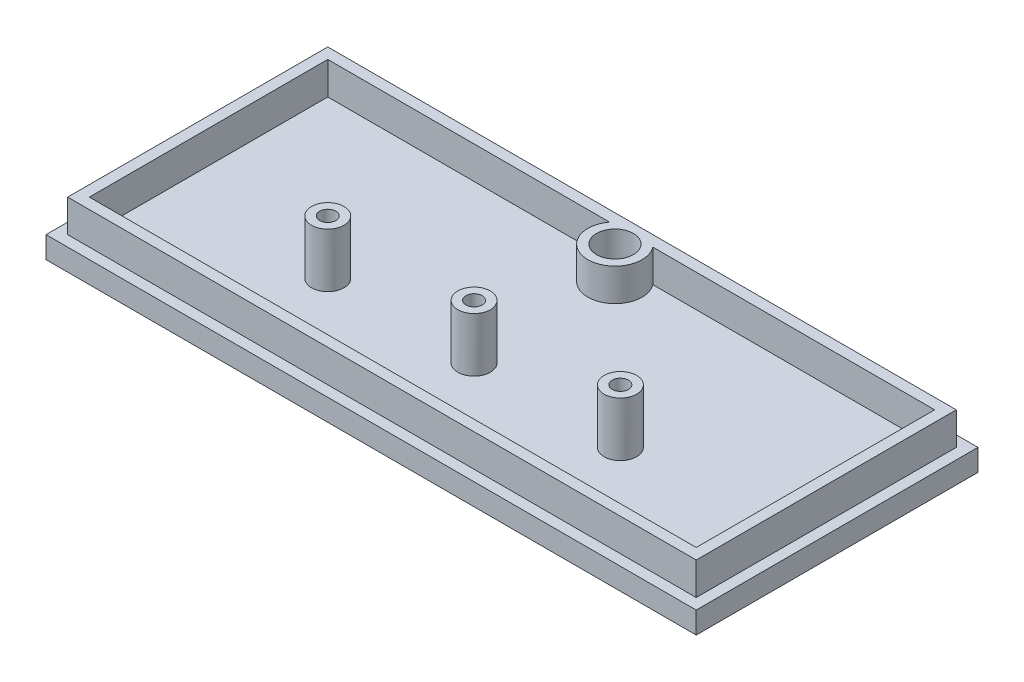
ISO-10303-21;
HEADER;
FILE_DESCRIPTION(('STEP AP214'),'2;1');
FILE_NAME('part.step','',(''),(''),'','','');
FILE_SCHEMA(('AUTOMOTIVE_DESIGN { 1 0 10303 214 1 1 1 1 }'));
ENDSEC;
DATA;
#1=APPLICATION_CONTEXT('core data for automotive mechanical design processes');
#2=APPLICATION_PROTOCOL_DEFINITION('international standard','automotive_design',2000,#1);
#3=PRODUCT_CONTEXT('',#1,'mechanical');
#4=PRODUCT('Part','Part','',(#3));
#5=PRODUCT_RELATED_PRODUCT_CATEGORY('part','',(#4));
#6=PRODUCT_DEFINITION_FORMATION('','',#4);
#7=PRODUCT_DEFINITION_CONTEXT('part definition',#1,'design');
#8=PRODUCT_DEFINITION('design','',#6,#7);
#9=PRODUCT_DEFINITION_SHAPE('','',#8);
#10=(LENGTH_UNIT() NAMED_UNIT(*) SI_UNIT(.MILLI.,.METRE.));
#11=(NAMED_UNIT(*) PLANE_ANGLE_UNIT() SI_UNIT($,.RADIAN.));
#12=(NAMED_UNIT(*) SI_UNIT($,.STERADIAN.) SOLID_ANGLE_UNIT());
#13=UNCERTAINTY_MEASURE_WITH_UNIT(LENGTH_MEASURE(1.E-05),#10,'distance_accuracy_value','');
#14=(GEOMETRIC_REPRESENTATION_CONTEXT(3) GLOBAL_UNCERTAINTY_ASSIGNED_CONTEXT((#13)) GLOBAL_UNIT_ASSIGNED_CONTEXT((#10,
#11,#12)) REPRESENTATION_CONTEXT('',''));
#15=CARTESIAN_POINT('',(0.,0.,0.));
#16=DIRECTION('',(0.,0.,1.));
#17=DIRECTION('',(1.,0.,0.));
#18=AXIS2_PLACEMENT_3D('',#15,#16,#17);
#19=CARTESIAN_POINT('',(2.,5.,-24.));
#20=DIRECTION('',(0.,0.,1.));
#21=DIRECTION('',(1.,0.,0.));
#22=AXIS2_PLACEMENT_3D('',#19,#20,#21);
#23=PLANE('',#22);
#24=DIRECTION('',(-1.,0.,0.));
#25=VECTOR('',#24,1.);
#26=CARTESIAN_POINT('',(2.,2.,-24.));
#27=LINE('',#26,#25);
#28=CARTESIAN_POINT('',(28.,2.,-24.));
#29=VERTEX_POINT('',#28);
#30=CARTESIAN_POINT('',(2.,2.,-24.));
#31=VERTEX_POINT('',#30);
#32=EDGE_CURVE('E144',#29,#31,#27,.T.);
#33=ORIENTED_EDGE('',*,*,#32,.F.);
#34=DIRECTION('',(0.,-1.,0.));
#35=VECTOR('',#34,1.);
#36=CARTESIAN_POINT('',(28.,5.,-24.));
#37=LINE('',#36,#35);
#38=CARTESIAN_POINT('',(28.,5.,-24.));
#39=VERTEX_POINT('',#38);
#40=EDGE_CURVE('E49',#29,#39,#37,.F.);
#41=ORIENTED_EDGE('',*,*,#40,.T.);
#42=DIRECTION('',(-1.,0.,0.));
#43=VECTOR('',#42,1.);
#44=CARTESIAN_POINT('',(2.,5.,-24.));
#45=LINE('',#44,#43);
#46=CARTESIAN_POINT('',(2.,5.,-24.));
#47=VERTEX_POINT('',#46);
#48=EDGE_CURVE('E191',#39,#47,#45,.T.);
#49=ORIENTED_EDGE('',*,*,#48,.T.);
#50=DIRECTION('',(0.,-1.,0.));
#51=VECTOR('',#50,1.);
#52=CARTESIAN_POINT('',(2.,5.,-24.));
#53=LINE('',#52,#51);
#54=EDGE_CURVE('E193',#47,#31,#53,.T.);
#55=ORIENTED_EDGE('',*,*,#54,.T.);
#56=EDGE_LOOP('',(#33,#41,#49,#55));
#57=FACE_BOUND('',#56,.T.);
#58=ADVANCED_FACE('F33',(#57),#23,.T.);
#59=CARTESIAN_POINT('',(58.,5.,-24.));
#60=VERTEX_POINT('',#59);
#61=CARTESIAN_POINT('',(32.,5.,-24.));
#62=VERTEX_POINT('',#61);
#63=EDGE_CURVE('E57',#60,#62,#45,.T.);
#64=ORIENTED_EDGE('',*,*,#63,.T.);
#65=DIRECTION('',(0.,-1.,0.));
#66=VECTOR('',#65,1.);
#67=CARTESIAN_POINT('',(32.,5.,-24.));
#68=LINE('',#67,#66);
#69=CARTESIAN_POINT('',(32.,2.,-24.));
#70=VERTEX_POINT('',#69);
#71=EDGE_CURVE('E146',#62,#70,#68,.T.);
#72=ORIENTED_EDGE('',*,*,#71,.T.);
#73=CARTESIAN_POINT('',(58.,2.,-24.));
#74=VERTEX_POINT('',#73);
#75=EDGE_CURVE('E137',#74,#70,#27,.T.);
#76=ORIENTED_EDGE('',*,*,#75,.F.);
#77=DIRECTION('',(0.,-1.,0.));
#78=VECTOR('',#77,1.);
#79=CARTESIAN_POINT('',(58.,5.,-24.));
#80=LINE('',#79,#78);
#81=EDGE_CURVE('E201',#60,#74,#80,.T.);
#82=ORIENTED_EDGE('',*,*,#81,.F.);
#83=EDGE_LOOP('',(#64,#72,#76,#82));
#84=FACE_BOUND('',#83,.T.);
#85=ADVANCED_FACE('F147',(#84),#23,.T.);
#86=CARTESIAN_POINT('',(0.,2.,0.));
#87=DIRECTION('',(0.,-1.,0.));
#88=DIRECTION('',(0.,0.,-1.));
#89=AXIS2_PLACEMENT_3D('',#86,#87,#88);
#90=PLANE('',#89);
#91=DIRECTION('',(0.,0.,1.));
#92=VECTOR('',#91,1.);
#93=CARTESIAN_POINT('',(0.,2.,0.));
#94=LINE('',#93,#92);
#95=CARTESIAN_POINT('',(0.,2.,-26.));
#96=VERTEX_POINT('',#95);
#97=CARTESIAN_POINT('',(0.,2.,0.));
#98=VERTEX_POINT('',#97);
#99=EDGE_CURVE('E241',#96,#98,#94,.T.);
#100=ORIENTED_EDGE('',*,*,#99,.T.);
#101=DIRECTION('',(1.,0.,0.));
#102=VECTOR('',#101,1.);
#103=CARTESIAN_POINT('',(0.,2.,0.));
#104=LINE('',#103,#102);
#105=CARTESIAN_POINT('',(60.,2.,0.));
#106=VERTEX_POINT('',#105);
#107=EDGE_CURVE('E244',#98,#106,#104,.T.);
#108=ORIENTED_EDGE('',*,*,#107,.T.);
#109=DIRECTION('',(0.,0.,-1.));
#110=VECTOR('',#109,1.);
#111=CARTESIAN_POINT('',(60.,2.,0.));
#112=LINE('',#111,#110);
#113=CARTESIAN_POINT('',(60.,2.,-26.));
#114=VERTEX_POINT('',#113);
#115=EDGE_CURVE('E247',#106,#114,#112,.T.);
#116=ORIENTED_EDGE('',*,*,#115,.T.);
#117=DIRECTION('',(-1.,0.,0.));
#118=VECTOR('',#117,1.);
#119=CARTESIAN_POINT('',(0.,2.,-26.));
#120=LINE('',#119,#118);
#121=EDGE_CURVE('E249',#114,#96,#120,.T.);
#122=ORIENTED_EDGE('',*,*,#121,.T.);
#123=EDGE_LOOP('',(#100,#108,#116,#122));
#124=FACE_BOUND('',#123,.T.);
#125=DIRECTION('',(0.,0.,1.));
#126=VECTOR('',#125,1.);
#127=CARTESIAN_POINT('',(0.999999999999995,2.,-25.));
#128=LINE('',#127,#126);
#129=CARTESIAN_POINT('',(0.999999999999995,2.,-25.));
#130=VERTEX_POINT('',#129);
#131=CARTESIAN_POINT('',(0.999999999999998,2.,-1.));
#132=VERTEX_POINT('',#131);
#133=EDGE_CURVE('E208',#130,#132,#128,.T.);
#134=ORIENTED_EDGE('',*,*,#133,.F.);
#135=DIRECTION('',(-1.,0.,0.));
#136=VECTOR('',#135,1.);
#137=CARTESIAN_POINT('',(0.999999999999995,2.,-25.));
#138=LINE('',#137,#136);
#139=CARTESIAN_POINT('',(59.,2.,-25.));
#140=VERTEX_POINT('',#139);
#141=EDGE_CURVE('E213',#140,#130,#138,.T.);
#142=ORIENTED_EDGE('',*,*,#141,.F.);
#143=DIRECTION('',(0.,0.,-1.));
#144=VECTOR('',#143,1.);
#145=CARTESIAN_POINT('',(59.,2.,-25.));
#146=LINE('',#145,#144);
#147=CARTESIAN_POINT('',(59.,2.,-1.));
#148=VERTEX_POINT('',#147);
#149=EDGE_CURVE('E225',#148,#140,#146,.T.);
#150=ORIENTED_EDGE('',*,*,#149,.F.);
#151=DIRECTION('',(1.,0.,0.));
#152=VECTOR('',#151,1.);
#153=CARTESIAN_POINT('',(0.999999999999998,2.,-1.));
#154=LINE('',#153,#152);
#155=EDGE_CURVE('E222',#132,#148,#154,.T.);
#156=ORIENTED_EDGE('',*,*,#155,.F.);
#157=EDGE_LOOP('',(#134,#142,#150,#156));
#158=FACE_BOUND('',#157,.T.);
#159=ADVANCED_FACE('F286',(#124,#158),#90,.F.);
#160=CARTESIAN_POINT('',(0.,2.,0.));
#161=DIRECTION('',(1.,0.,0.));
#162=DIRECTION('',(0.,0.,-1.));
#163=AXIS2_PLACEMENT_3D('',#160,#161,#162);
#164=PLANE('',#163);
#165=DIRECTION('',(0.,0.,1.));
#166=VECTOR('',#165,1.);
#167=CARTESIAN_POINT('',(0.,0.,0.));
#168=LINE('',#167,#166);
#169=CARTESIAN_POINT('',(0.,0.,-26.));
#170=VERTEX_POINT('',#169);
#171=CARTESIAN_POINT('',(0.,0.,0.));
#172=VERTEX_POINT('',#171);
#173=EDGE_CURVE('E240',#170,#172,#168,.T.);
#174=ORIENTED_EDGE('',*,*,#173,.T.);
#175=DIRECTION('',(0.,-1.,0.));
#176=VECTOR('',#175,1.);
#177=CARTESIAN_POINT('',(0.,2.,0.));
#178=LINE('',#177,#176);
#179=EDGE_CURVE('E267',#98,#172,#178,.T.);
#180=ORIENTED_EDGE('',*,*,#179,.F.);
#181=ORIENTED_EDGE('',*,*,#99,.F.);
#182=DIRECTION('',(0.,-1.,0.));
#183=VECTOR('',#182,1.);
#184=CARTESIAN_POINT('',(0.,2.,-26.));
#185=LINE('',#184,#183);
#186=EDGE_CURVE('E251',#96,#170,#185,.T.);
#187=ORIENTED_EDGE('',*,*,#186,.T.);
#188=EDGE_LOOP('',(#174,#180,#181,#187));
#189=FACE_BOUND('',#188,.T.);
#190=ADVANCED_FACE('F35',(#189),#164,.F.);
#191=CARTESIAN_POINT('',(0.,2.,0.));
#192=DIRECTION('',(0.,0.,-1.));
#193=DIRECTION('',(-1.,0.,0.));
#194=AXIS2_PLACEMENT_3D('',#191,#192,#193);
#195=PLANE('',#194);
#196=DIRECTION('',(1.,0.,0.));
#197=VECTOR('',#196,1.);
#198=CARTESIAN_POINT('',(0.,0.,0.));
#199=LINE('',#198,#197);
#200=CARTESIAN_POINT('',(60.,0.,0.));
#201=VERTEX_POINT('',#200);
#202=EDGE_CURVE('E254',#172,#201,#199,.T.);
#203=ORIENTED_EDGE('',*,*,#202,.T.);
#204=DIRECTION('',(0.,-1.,0.));
#205=VECTOR('',#204,1.);
#206=CARTESIAN_POINT('',(60.,2.,0.));
#207=LINE('',#206,#205);
#208=EDGE_CURVE('E264',#106,#201,#207,.T.);
#209=ORIENTED_EDGE('',*,*,#208,.F.);
#210=ORIENTED_EDGE('',*,*,#107,.F.);
#211=ORIENTED_EDGE('',*,*,#179,.T.);
#212=EDGE_LOOP('',(#203,#209,#210,#211));
#213=FACE_BOUND('',#212,.T.);
#214=ADVANCED_FACE('F353',(#213),#195,.F.);
#215=CARTESIAN_POINT('',(60.,2.,0.));
#216=DIRECTION('',(-1.,0.,0.));
#217=DIRECTION('',(0.,0.,1.));
#218=AXIS2_PLACEMENT_3D('',#215,#216,#217);
#219=PLANE('',#218);
#220=DIRECTION('',(0.,0.,-1.));
#221=VECTOR('',#220,1.);
#222=CARTESIAN_POINT('',(60.,0.,0.));
#223=LINE('',#222,#221);
#224=CARTESIAN_POINT('',(60.,0.,-26.));
#225=VERTEX_POINT('',#224);
#226=EDGE_CURVE('E256',#201,#225,#223,.T.);
#227=ORIENTED_EDGE('',*,*,#226,.T.);
#228=DIRECTION('',(0.,-1.,0.));
#229=VECTOR('',#228,1.);
#230=CARTESIAN_POINT('',(60.,2.,-26.));
#231=LINE('',#230,#229);
#232=EDGE_CURVE('E261',#114,#225,#231,.T.);
#233=ORIENTED_EDGE('',*,*,#232,.F.);
#234=ORIENTED_EDGE('',*,*,#115,.F.);
#235=ORIENTED_EDGE('',*,*,#208,.T.);
#236=EDGE_LOOP('',(#227,#233,#234,#235));
#237=FACE_BOUND('',#236,.T.);
#238=ADVANCED_FACE('F350',(#237),#219,.F.);
#239=CARTESIAN_POINT('',(0.,2.,-26.));
#240=DIRECTION('',(0.,0.,1.));
#241=DIRECTION('',(1.,0.,0.));
#242=AXIS2_PLACEMENT_3D('',#239,#240,#241);
#243=PLANE('',#242);
#244=DIRECTION('',(-1.,0.,0.));
#245=VECTOR('',#244,1.);
#246=CARTESIAN_POINT('',(0.,0.,-26.));
#247=LINE('',#246,#245);
#248=EDGE_CURVE('E245',#225,#170,#247,.T.);
#249=ORIENTED_EDGE('',*,*,#248,.T.);
#250=ORIENTED_EDGE('',*,*,#186,.F.);
#251=ORIENTED_EDGE('',*,*,#121,.F.);
#252=ORIENTED_EDGE('',*,*,#232,.T.);
#253=EDGE_LOOP('',(#249,#250,#251,#252));
#254=FACE_BOUND('',#253,.T.);
#255=ADVANCED_FACE('F346',(#254),#243,.F.);
#256=CARTESIAN_POINT('',(0.,0.,0.));
#257=DIRECTION('',(0.,-1.,0.));
#258=DIRECTION('',(0.,0.,-1.));
#259=AXIS2_PLACEMENT_3D('',#256,#257,#258);
#260=PLANE('',#259);
#261=CARTESIAN_POINT('',(30.,0.,-22.5));
#262=DIRECTION('',(0.,-1.,0.));
#263=DIRECTION('',(0.,0.,-1.));
#264=AXIS2_PLACEMENT_3D('',#261,#262,#263);
#265=CIRCLE('',#264,3.15);
#266=CARTESIAN_POINT('',(30.,0.,-25.65));
#267=VERTEX_POINT('',#266);
#268=EDGE_CURVE('E397',#267,#267,#265,.T.);
#269=ORIENTED_EDGE('',*,*,#268,.F.);
#270=EDGE_LOOP('',(#269));
#271=FACE_BOUND('',#270,.T.);
#272=ORIENTED_EDGE('',*,*,#173,.F.);
#273=ORIENTED_EDGE('',*,*,#248,.F.);
#274=ORIENTED_EDGE('',*,*,#226,.F.);
#275=ORIENTED_EDGE('',*,*,#202,.F.);
#276=EDGE_LOOP('',(#272,#273,#274,#275));
#277=FACE_BOUND('',#276,.T.);
#278=ADVANCED_FACE('F328',(#271,#277),#260,.T.);
#279=CARTESIAN_POINT('',(0.,5.,0.));
#280=DIRECTION('',(0.,1.,0.));
#281=DIRECTION('',(0.,0.,1.));
#282=AXIS2_PLACEMENT_3D('',#279,#280,#281);
#283=PLANE('',#282);
#284=CARTESIAN_POINT('',(30.,5.,-22.5));
#285=DIRECTION('',(0.,1.,0.));
#286=DIRECTION('',(0.,0.,1.));
#287=AXIS2_PLACEMENT_3D('',#284,#285,#286);
#288=CIRCLE('',#287,1.7);
#289=CARTESIAN_POINT('',(30.,5.,-20.8));
#290=VERTEX_POINT('',#289);
#291=EDGE_CURVE('E37',#290,#290,#288,.T.);
#292=ORIENTED_EDGE('',*,*,#291,.F.);
#293=EDGE_LOOP('',(#292));
#294=FACE_BOUND('',#293,.T.);
#295=DIRECTION('',(-1.,0.,0.));
#296=VECTOR('',#295,1.);
#297=CARTESIAN_POINT('',(0.999999999999995,5.,-25.));
#298=LINE('',#297,#296);
#299=CARTESIAN_POINT('',(59.,5.,-25.));
#300=VERTEX_POINT('',#299);
#301=CARTESIAN_POINT('',(0.999999999999995,5.,-25.));
#302=VERTEX_POINT('',#301);
#303=EDGE_CURVE('E217',#300,#302,#298,.T.);
#304=ORIENTED_EDGE('',*,*,#303,.T.);
#305=DIRECTION('',(0.,0.,1.));
#306=VECTOR('',#305,1.);
#307=CARTESIAN_POINT('',(0.999999999999995,5.,-25.));
#308=LINE('',#307,#306);
#309=CARTESIAN_POINT('',(0.999999999999998,5.,-1.));
#310=VERTEX_POINT('',#309);
#311=EDGE_CURVE('E209',#302,#310,#308,.T.);
#312=ORIENTED_EDGE('',*,*,#311,.T.);
#313=DIRECTION('',(1.,0.,0.));
#314=VECTOR('',#313,1.);
#315=CARTESIAN_POINT('',(0.999999999999998,5.,-1.));
#316=LINE('',#315,#314);
#317=CARTESIAN_POINT('',(59.,5.,-1.));
#318=VERTEX_POINT('',#317);
#319=EDGE_CURVE('E212',#310,#318,#316,.T.);
#320=ORIENTED_EDGE('',*,*,#319,.T.);
#321=DIRECTION('',(0.,0.,-1.));
#322=VECTOR('',#321,1.);
#323=CARTESIAN_POINT('',(59.,5.,-25.));
#324=LINE('',#323,#322);
#325=EDGE_CURVE('E215',#318,#300,#324,.T.);
#326=ORIENTED_EDGE('',*,*,#325,.T.);
#327=EDGE_LOOP('',(#304,#312,#320,#326));
#328=FACE_BOUND('',#327,.T.);
#329=ORIENTED_EDGE('',*,*,#48,.F.);
#330=CARTESIAN_POINT('',(30.,5.,-22.5));
#331=DIRECTION('',(0.,1.,0.));
#332=DIRECTION('',(0.,0.,1.));
#333=AXIS2_PLACEMENT_3D('',#330,#331,#332);
#334=CIRCLE('',#333,2.5);
#335=EDGE_CURVE('E151',#39,#62,#334,.T.);
#336=ORIENTED_EDGE('',*,*,#335,.T.);
#337=ORIENTED_EDGE('',*,*,#63,.F.);
#338=DIRECTION('',(0.,0.,-1.));
#339=VECTOR('',#338,1.);
#340=CARTESIAN_POINT('',(58.,5.,-24.));
#341=LINE('',#340,#339);
#342=CARTESIAN_POINT('',(58.,5.,-2.));
#343=VERTEX_POINT('',#342);
#344=EDGE_CURVE('E188',#343,#60,#341,.T.);
#345=ORIENTED_EDGE('',*,*,#344,.F.);
#346=DIRECTION('',(1.,0.,0.));
#347=VECTOR('',#346,1.);
#348=CARTESIAN_POINT('',(2.,5.,-2.));
#349=LINE('',#348,#347);
#350=CARTESIAN_POINT('',(2.,5.,-2.));
#351=VERTEX_POINT('',#350);
#352=EDGE_CURVE('E186',#351,#343,#349,.T.);
#353=ORIENTED_EDGE('',*,*,#352,.F.);
#354=DIRECTION('',(0.,0.,1.));
#355=VECTOR('',#354,1.);
#356=CARTESIAN_POINT('',(2.,5.,-24.));
#357=LINE('',#356,#355);
#358=EDGE_CURVE('E143',#47,#351,#357,.T.);
#359=ORIENTED_EDGE('',*,*,#358,.F.);
#360=EDGE_LOOP('',(#329,#336,#337,#345,#353,#359));
#361=FACE_BOUND('',#360,.T.);
#362=ADVANCED_FACE('F324',(#294,#328,#361),#283,.T.);
#363=CARTESIAN_POINT('',(0.999999999999995,5.,-25.));
#364=DIRECTION('',(1.,0.,0.));
#365=DIRECTION('',(0.,0.,-1.));
#366=AXIS2_PLACEMENT_3D('',#363,#364,#365);
#367=PLANE('',#366);
#368=ORIENTED_EDGE('',*,*,#133,.T.);
#369=DIRECTION('',(0.,-1.,0.));
#370=VECTOR('',#369,1.);
#371=CARTESIAN_POINT('',(0.999999999999998,5.,-1.));
#372=LINE('',#371,#370);
#373=EDGE_CURVE('E237',#310,#132,#372,.T.);
#374=ORIENTED_EDGE('',*,*,#373,.F.);
#375=ORIENTED_EDGE('',*,*,#311,.F.);
#376=DIRECTION('',(0.,-1.,0.));
#377=VECTOR('',#376,1.);
#378=CARTESIAN_POINT('',(0.999999999999995,5.,-25.));
#379=LINE('',#378,#377);
#380=EDGE_CURVE('E219',#302,#130,#379,.T.);
#381=ORIENTED_EDGE('',*,*,#380,.T.);
#382=EDGE_LOOP('',(#368,#374,#375,#381));
#383=FACE_BOUND('',#382,.T.);
#384=ADVANCED_FACE('F327',(#383),#367,.F.);
#385=CARTESIAN_POINT('',(0.999999999999998,5.,-1.));
#386=DIRECTION('',(0.,0.,-1.));
#387=DIRECTION('',(-1.,0.,0.));
#388=AXIS2_PLACEMENT_3D('',#385,#386,#387);
#389=PLANE('',#388);
#390=ORIENTED_EDGE('',*,*,#155,.T.);
#391=DIRECTION('',(0.,-1.,0.));
#392=VECTOR('',#391,1.);
#393=CARTESIAN_POINT('',(59.,5.,-1.));
#394=LINE('',#393,#392);
#395=EDGE_CURVE('E234',#318,#148,#394,.T.);
#396=ORIENTED_EDGE('',*,*,#395,.F.);
#397=ORIENTED_EDGE('',*,*,#319,.F.);
#398=ORIENTED_EDGE('',*,*,#373,.T.);
#399=EDGE_LOOP('',(#390,#396,#397,#398));
#400=FACE_BOUND('',#399,.T.);
#401=ADVANCED_FACE('F336',(#400),#389,.F.);
#402=CARTESIAN_POINT('',(59.,5.,-25.));
#403=DIRECTION('',(-1.,0.,0.));
#404=DIRECTION('',(0.,0.,1.));
#405=AXIS2_PLACEMENT_3D('',#402,#403,#404);
#406=PLANE('',#405);
#407=ORIENTED_EDGE('',*,*,#149,.T.);
#408=DIRECTION('',(0.,-1.,0.));
#409=VECTOR('',#408,1.);
#410=CARTESIAN_POINT('',(59.,5.,-25.));
#411=LINE('',#410,#409);
#412=EDGE_CURVE('E231',#300,#140,#411,.T.);
#413=ORIENTED_EDGE('',*,*,#412,.F.);
#414=ORIENTED_EDGE('',*,*,#325,.F.);
#415=ORIENTED_EDGE('',*,*,#395,.T.);
#416=EDGE_LOOP('',(#407,#413,#414,#415));
#417=FACE_BOUND('',#416,.T.);
#418=ADVANCED_FACE('F332',(#417),#406,.F.);
#419=CARTESIAN_POINT('',(0.999999999999995,5.,-25.));
#420=DIRECTION('',(0.,0.,1.));
#421=DIRECTION('',(1.,0.,0.));
#422=AXIS2_PLACEMENT_3D('',#419,#420,#421);
#423=PLANE('',#422);
#424=ORIENTED_EDGE('',*,*,#141,.T.);
#425=ORIENTED_EDGE('',*,*,#380,.F.);
#426=ORIENTED_EDGE('',*,*,#303,.F.);
#427=ORIENTED_EDGE('',*,*,#412,.T.);
#428=EDGE_LOOP('',(#424,#425,#426,#427));
#429=FACE_BOUND('',#428,.T.);
#430=ADVANCED_FACE('F322',(#429),#423,.F.);
#431=CARTESIAN_POINT('',(2.,5.,-24.));
#432=DIRECTION('',(1.,0.,0.));
#433=DIRECTION('',(0.,0.,-1.));
#434=AXIS2_PLACEMENT_3D('',#431,#432,#433);
#435=PLANE('',#434);
#436=DIRECTION('',(0.,0.,1.));
#437=VECTOR('',#436,1.);
#438=CARTESIAN_POINT('',(2.,2.,-24.));
#439=LINE('',#438,#437);
#440=CARTESIAN_POINT('',(2.,2.,-2.));
#441=VERTEX_POINT('',#440);
#442=EDGE_CURVE('E184',#31,#441,#439,.T.);
#443=ORIENTED_EDGE('',*,*,#442,.F.);
#444=ORIENTED_EDGE('',*,*,#54,.F.);
#445=ORIENTED_EDGE('',*,*,#358,.T.);
#446=DIRECTION('',(0.,-1.,0.));
#447=VECTOR('',#446,1.);
#448=CARTESIAN_POINT('',(2.,5.,-2.));
#449=LINE('',#448,#447);
#450=EDGE_CURVE('E205',#351,#441,#449,.T.);
#451=ORIENTED_EDGE('',*,*,#450,.T.);
#452=EDGE_LOOP('',(#443,#444,#445,#451));
#453=FACE_BOUND('',#452,.T.);
#454=ADVANCED_FACE('F318',(#453),#435,.T.);
#455=CARTESIAN_POINT('',(2.,5.,-2.));
#456=DIRECTION('',(0.,0.,-1.));
#457=DIRECTION('',(-1.,0.,0.));
#458=AXIS2_PLACEMENT_3D('',#455,#456,#457);
#459=PLANE('',#458);
#460=DIRECTION('',(1.,0.,0.));
#461=VECTOR('',#460,1.);
#462=CARTESIAN_POINT('',(2.,2.,-2.));
#463=LINE('',#462,#461);
#464=CARTESIAN_POINT('',(58.,2.,-2.));
#465=VERTEX_POINT('',#464);
#466=EDGE_CURVE('E196',#441,#465,#463,.T.);
#467=ORIENTED_EDGE('',*,*,#466,.F.);
#468=ORIENTED_EDGE('',*,*,#450,.F.);
#469=ORIENTED_EDGE('',*,*,#352,.T.);
#470=DIRECTION('',(0.,-1.,0.));
#471=VECTOR('',#470,1.);
#472=CARTESIAN_POINT('',(58.,5.,-2.));
#473=LINE('',#472,#471);
#474=EDGE_CURVE('E203',#343,#465,#473,.T.);
#475=ORIENTED_EDGE('',*,*,#474,.T.);
#476=EDGE_LOOP('',(#467,#468,#469,#475));
#477=FACE_BOUND('',#476,.T.);
#478=ADVANCED_FACE('F314',(#477),#459,.T.);
#479=CARTESIAN_POINT('',(58.,5.,-24.));
#480=DIRECTION('',(-1.,0.,0.));
#481=DIRECTION('',(0.,0.,1.));
#482=AXIS2_PLACEMENT_3D('',#479,#480,#481);
#483=PLANE('',#482);
#484=DIRECTION('',(0.,0.,-1.));
#485=VECTOR('',#484,1.);
#486=CARTESIAN_POINT('',(58.,2.,-24.));
#487=LINE('',#486,#485);
#488=EDGE_CURVE('E142',#465,#74,#487,.T.);
#489=ORIENTED_EDGE('',*,*,#488,.F.);
#490=ORIENTED_EDGE('',*,*,#474,.F.);
#491=ORIENTED_EDGE('',*,*,#344,.T.);
#492=ORIENTED_EDGE('',*,*,#81,.T.);
#493=EDGE_LOOP('',(#489,#490,#491,#492));
#494=FACE_BOUND('',#493,.T.);
#495=ADVANCED_FACE('F283',(#494),#483,.T.);
#496=CARTESIAN_POINT('',(30.,2.,-22.5));
#497=DIRECTION('',(0.,-1.,0.));
#498=DIRECTION('',(0.,0.,-1.));
#499=AXIS2_PLACEMENT_3D('',#496,#497,#498);
#500=CIRCLE('',#499,2.5);
#501=EDGE_CURVE('E11',#29,#70,#500,.F.);
#502=ORIENTED_EDGE('',*,*,#501,.F.);
#503=ORIENTED_EDGE('',*,*,#32,.T.);
#504=ORIENTED_EDGE('',*,*,#442,.T.);
#505=ORIENTED_EDGE('',*,*,#466,.T.);
#506=ORIENTED_EDGE('',*,*,#488,.T.);
#507=ORIENTED_EDGE('',*,*,#75,.T.);
#508=EDGE_LOOP('',(#502,#503,#504,#505,#506,#507));
#509=FACE_BOUND('',#508,.T.);
#510=CARTESIAN_POINT('',(43.5,2.,-9.5));
#511=DIRECTION('',(0.,-1.,0.));
#512=DIRECTION('',(0.,0.,-1.));
#513=AXIS2_PLACEMENT_3D('',#510,#511,#512);
#514=CIRCLE('',#513,1.5);
#515=CARTESIAN_POINT('',(43.5,2.,-11.));
#516=VERTEX_POINT('',#515);
#517=EDGE_CURVE('E42',#516,#516,#514,.F.);
#518=ORIENTED_EDGE('',*,*,#517,.F.);
#519=EDGE_LOOP('',(#518));
#520=FACE_BOUND('',#519,.T.);
#521=CARTESIAN_POINT('',(30.,2.,-9.5));
#522=DIRECTION('',(0.,-1.,0.));
#523=DIRECTION('',(0.,0.,-1.));
#524=AXIS2_PLACEMENT_3D('',#521,#522,#523);
#525=CIRCLE('',#524,1.5);
#526=CARTESIAN_POINT('',(30.,2.,-11.));
#527=VERTEX_POINT('',#526);
#528=EDGE_CURVE('E273',#527,#527,#525,.F.);
#529=ORIENTED_EDGE('',*,*,#528,.F.);
#530=EDGE_LOOP('',(#529));
#531=FACE_BOUND('',#530,.T.);
#532=CARTESIAN_POINT('',(16.5,2.,-9.5));
#533=DIRECTION('',(0.,-1.,0.));
#534=DIRECTION('',(0.,0.,-1.));
#535=AXIS2_PLACEMENT_3D('',#532,#533,#534);
#536=CIRCLE('',#535,1.5);
#537=CARTESIAN_POINT('',(16.5,2.,-11.));
#538=VERTEX_POINT('',#537);
#539=EDGE_CURVE('E270',#538,#538,#536,.F.);
#540=ORIENTED_EDGE('',*,*,#539,.F.);
#541=EDGE_LOOP('',(#540));
#542=FACE_BOUND('',#541,.T.);
#543=ADVANCED_FACE('F138',(#509,#520,#531,#542),#90,.F.);
#544=CARTESIAN_POINT('',(16.5,7.,-9.5));
#545=DIRECTION('',(0.,1.,0.));
#546=DIRECTION('',(0.,0.,1.));
#547=AXIS2_PLACEMENT_3D('',#544,#545,#546);
#548=PLANE('',#547);
#549=CARTESIAN_POINT('',(16.5,7.,-9.5));
#550=DIRECTION('',(0.,1.,0.));
#551=DIRECTION('',(0.,0.,1.));
#552=AXIS2_PLACEMENT_3D('',#549,#550,#551);
#553=CIRCLE('',#552,1.5);
#554=CARTESIAN_POINT('',(16.5,7.,-8.));
#555=VERTEX_POINT('',#554);
#556=EDGE_CURVE('E179',#555,#555,#553,.T.);
#557=ORIENTED_EDGE('',*,*,#556,.T.);
#558=EDGE_LOOP('',(#557));
#559=FACE_BOUND('',#558,.T.);
#560=CARTESIAN_POINT('',(16.5,7.,-9.5));
#561=DIRECTION('',(0.,1.,0.));
#562=DIRECTION('',(0.,0.,1.));
#563=AXIS2_PLACEMENT_3D('',#560,#561,#562);
#564=CIRCLE('',#563,0.750000000000002);
#565=CARTESIAN_POINT('',(16.5,7.,-8.75));
#566=VERTEX_POINT('',#565);
#567=EDGE_CURVE('E176',#566,#566,#564,.T.);
#568=ORIENTED_EDGE('',*,*,#567,.F.);
#569=EDGE_LOOP('',(#568));
#570=FACE_BOUND('',#569,.T.);
#571=ADVANCED_FACE('F282',(#559,#570),#548,.T.);
#572=CARTESIAN_POINT('',(16.5,7.,-9.5));
#573=DIRECTION('',(0.,-1.,0.));
#574=DIRECTION('',(0.,0.,-1.));
#575=AXIS2_PLACEMENT_3D('',#572,#573,#574);
#576=CYLINDRICAL_SURFACE('',#575,1.5);
#577=ORIENTED_EDGE('',*,*,#556,.F.);
#578=EDGE_LOOP('',(#577));
#579=FACE_BOUND('',#578,.T.);
#580=ORIENTED_EDGE('',*,*,#539,.T.);
#581=EDGE_LOOP('',(#580));
#582=FACE_BOUND('',#581,.T.);
#583=ADVANCED_FACE('F291',(#579,#582),#576,.T.);
#584=CARTESIAN_POINT('',(16.5,7.,-9.5));
#585=DIRECTION('',(0.,-1.,0.));
#586=DIRECTION('',(0.,0.,-1.));
#587=AXIS2_PLACEMENT_3D('',#584,#585,#586);
#588=CYLINDRICAL_SURFACE('',#587,0.750000000000002);
#589=ORIENTED_EDGE('',*,*,#567,.T.);
#590=EDGE_LOOP('',(#589));
#591=FACE_BOUND('',#590,.T.);
#592=CARTESIAN_POINT('',(16.5,2.,-9.5));
#593=DIRECTION('',(0.,1.,0.));
#594=DIRECTION('',(0.,0.,1.));
#595=AXIS2_PLACEMENT_3D('',#592,#593,#594);
#596=CIRCLE('',#595,0.750000000000002);
#597=CARTESIAN_POINT('',(16.5,2.,-8.75));
#598=VERTEX_POINT('',#597);
#599=EDGE_CURVE('E175',#598,#598,#596,.T.);
#600=ORIENTED_EDGE('',*,*,#599,.F.);
#601=EDGE_LOOP('',(#600));
#602=FACE_BOUND('',#601,.T.);
#603=ADVANCED_FACE('F293',(#591,#602),#588,.F.);
#604=ORIENTED_EDGE('',*,*,#599,.T.);
#605=EDGE_LOOP('',(#604));
#606=FACE_BOUND('',#605,.T.);
#607=ADVANCED_FACE('F300',(#606),#90,.F.);
#608=CARTESIAN_POINT('',(30.,7.,-9.5));
#609=DIRECTION('',(0.,1.,0.));
#610=DIRECTION('',(0.,0.,1.));
#611=AXIS2_PLACEMENT_3D('',#608,#609,#610);
#612=PLANE('',#611);
#613=CARTESIAN_POINT('',(30.,7.,-9.5));
#614=DIRECTION('',(0.,1.,0.));
#615=DIRECTION('',(0.,0.,1.));
#616=AXIS2_PLACEMENT_3D('',#613,#614,#615);
#617=CIRCLE('',#616,1.5);
#618=CARTESIAN_POINT('',(30.,7.,-7.99999999999999));
#619=VERTEX_POINT('',#618);
#620=EDGE_CURVE('E170',#619,#619,#617,.T.);
#621=ORIENTED_EDGE('',*,*,#620,.T.);
#622=EDGE_LOOP('',(#621));
#623=FACE_BOUND('',#622,.T.);
#624=CARTESIAN_POINT('',(30.,7.,-9.5));
#625=DIRECTION('',(0.,1.,0.));
#626=DIRECTION('',(0.,0.,1.));
#627=AXIS2_PLACEMENT_3D('',#624,#625,#626);
#628=CIRCLE('',#627,0.749999999999998);
#629=CARTESIAN_POINT('',(30.,7.,-8.75));
#630=VERTEX_POINT('',#629);
#631=EDGE_CURVE('E167',#630,#630,#628,.T.);
#632=ORIENTED_EDGE('',*,*,#631,.F.);
#633=EDGE_LOOP('',(#632));
#634=FACE_BOUND('',#633,.T.);
#635=ADVANCED_FACE('F432',(#623,#634),#612,.T.);
#636=CARTESIAN_POINT('',(30.,7.,-9.5));
#637=DIRECTION('',(0.,-1.,0.));
#638=DIRECTION('',(0.,0.,-1.));
#639=AXIS2_PLACEMENT_3D('',#636,#637,#638);
#640=CYLINDRICAL_SURFACE('',#639,1.5);
#641=ORIENTED_EDGE('',*,*,#620,.F.);
#642=EDGE_LOOP('',(#641));
#643=FACE_BOUND('',#642,.T.);
#644=ORIENTED_EDGE('',*,*,#528,.T.);
#645=EDGE_LOOP('',(#644));
#646=FACE_BOUND('',#645,.T.);
#647=ADVANCED_FACE('F430',(#643,#646),#640,.T.);
#648=CARTESIAN_POINT('',(30.,7.,-9.5));
#649=DIRECTION('',(0.,-1.,0.));
#650=DIRECTION('',(0.,0.,-1.));
#651=AXIS2_PLACEMENT_3D('',#648,#649,#650);
#652=CYLINDRICAL_SURFACE('',#651,0.749999999999998);
#653=ORIENTED_EDGE('',*,*,#631,.T.);
#654=EDGE_LOOP('',(#653));
#655=FACE_BOUND('',#654,.T.);
#656=CARTESIAN_POINT('',(30.,2.,-9.5));
#657=DIRECTION('',(0.,1.,0.));
#658=DIRECTION('',(0.,0.,1.));
#659=AXIS2_PLACEMENT_3D('',#656,#657,#658);
#660=CIRCLE('',#659,0.749999999999998);
#661=CARTESIAN_POINT('',(30.,2.,-8.75));
#662=VERTEX_POINT('',#661);
#663=EDGE_CURVE('E166',#662,#662,#660,.T.);
#664=ORIENTED_EDGE('',*,*,#663,.F.);
#665=EDGE_LOOP('',(#664));
#666=FACE_BOUND('',#665,.T.);
#667=ADVANCED_FACE('F427',(#655,#666),#652,.F.);
#668=ORIENTED_EDGE('',*,*,#663,.T.);
#669=EDGE_LOOP('',(#668));
#670=FACE_BOUND('',#669,.T.);
#671=ADVANCED_FACE('F422',(#670),#90,.F.);
#672=CARTESIAN_POINT('',(43.5,7.,-9.5));
#673=DIRECTION('',(0.,1.,0.));
#674=DIRECTION('',(0.,0.,1.));
#675=AXIS2_PLACEMENT_3D('',#672,#673,#674);
#676=PLANE('',#675);
#677=CARTESIAN_POINT('',(43.5,7.,-9.5));
#678=DIRECTION('',(0.,1.,0.));
#679=DIRECTION('',(0.,0.,1.));
#680=AXIS2_PLACEMENT_3D('',#677,#678,#679);
#681=CIRCLE('',#680,1.5);
#682=CARTESIAN_POINT('',(43.5,7.,-7.99999999999999));
#683=VERTEX_POINT('',#682);
#684=EDGE_CURVE('E162',#683,#683,#681,.T.);
#685=ORIENTED_EDGE('',*,*,#684,.T.);
#686=EDGE_LOOP('',(#685));
#687=FACE_BOUND('',#686,.T.);
#688=CARTESIAN_POINT('',(43.5,7.,-9.5));
#689=DIRECTION('',(0.,1.,0.));
#690=DIRECTION('',(0.,0.,1.));
#691=AXIS2_PLACEMENT_3D('',#688,#689,#690);
#692=CIRCLE('',#691,0.749999999999999);
#693=CARTESIAN_POINT('',(43.5,7.,-8.75));
#694=VERTEX_POINT('',#693);
#695=EDGE_CURVE('E157',#694,#694,#692,.T.);
#696=ORIENTED_EDGE('',*,*,#695,.F.);
#697=EDGE_LOOP('',(#696));
#698=FACE_BOUND('',#697,.T.);
#699=ADVANCED_FACE('F419',(#687,#698),#676,.T.);
#700=CARTESIAN_POINT('',(43.5,7.,-9.5));
#701=DIRECTION('',(0.,-1.,0.));
#702=DIRECTION('',(0.,0.,-1.));
#703=AXIS2_PLACEMENT_3D('',#700,#701,#702);
#704=CYLINDRICAL_SURFACE('',#703,1.5);
#705=ORIENTED_EDGE('',*,*,#684,.F.);
#706=EDGE_LOOP('',(#705));
#707=FACE_BOUND('',#706,.T.);
#708=ORIENTED_EDGE('',*,*,#517,.T.);
#709=EDGE_LOOP('',(#708));
#710=FACE_BOUND('',#709,.T.);
#711=ADVANCED_FACE('F279',(#707,#710),#704,.T.);
#712=CARTESIAN_POINT('',(43.5,7.,-9.5));
#713=DIRECTION('',(0.,-1.,0.));
#714=DIRECTION('',(0.,0.,-1.));
#715=AXIS2_PLACEMENT_3D('',#712,#713,#714);
#716=CYLINDRICAL_SURFACE('',#715,0.749999999999999);
#717=ORIENTED_EDGE('',*,*,#695,.T.);
#718=EDGE_LOOP('',(#717));
#719=FACE_BOUND('',#718,.T.);
#720=CARTESIAN_POINT('',(43.5,2.,-9.5));
#721=DIRECTION('',(0.,1.,0.));
#722=DIRECTION('',(0.,0.,1.));
#723=AXIS2_PLACEMENT_3D('',#720,#721,#722);
#724=CIRCLE('',#723,0.749999999999999);
#725=CARTESIAN_POINT('',(43.5,2.,-8.75));
#726=VERTEX_POINT('',#725);
#727=EDGE_CURVE('E154',#726,#726,#724,.T.);
#728=ORIENTED_EDGE('',*,*,#727,.F.);
#729=EDGE_LOOP('',(#728));
#730=FACE_BOUND('',#729,.T.);
#731=ADVANCED_FACE('F415',(#719,#730),#716,.F.);
#732=ORIENTED_EDGE('',*,*,#727,.T.);
#733=EDGE_LOOP('',(#732));
#734=FACE_BOUND('',#733,.T.);
#735=ADVANCED_FACE('F285',(#734),#90,.F.);
#736=CARTESIAN_POINT('',(30.,5.,-22.5));
#737=DIRECTION('',(0.,-1.,0.));
#738=DIRECTION('',(0.,0.,-1.));
#739=AXIS2_PLACEMENT_3D('',#736,#737,#738);
#740=CYLINDRICAL_SURFACE('',#739,2.5);
#741=ORIENTED_EDGE('',*,*,#40,.F.);
#742=ORIENTED_EDGE('',*,*,#501,.T.);
#743=ORIENTED_EDGE('',*,*,#71,.F.);
#744=ORIENTED_EDGE('',*,*,#335,.F.);
#745=EDGE_LOOP('',(#741,#742,#743,#744));
#746=FACE_BOUND('',#745,.T.);
#747=ADVANCED_FACE('F153',(#746),#740,.T.);
#748=CARTESIAN_POINT('',(30.,0.,-22.5));
#749=DIRECTION('',(0.,-1.,0.));
#750=DIRECTION('',(0.,0.,-1.));
#751=AXIS2_PLACEMENT_3D('',#748,#749,#750);
#752=CYLINDRICAL_SURFACE('',#751,1.7);
#753=ORIENTED_EDGE('',*,*,#291,.T.);
#754=EDGE_LOOP('',(#753));
#755=FACE_BOUND('',#754,.T.);
#756=CARTESIAN_POINT('',(30.,1.45,-22.5));
#757=DIRECTION('',(0.,-1.,0.));
#758=DIRECTION('',(0.,0.,-1.));
#759=AXIS2_PLACEMENT_3D('',#756,#757,#758);
#760=CIRCLE('',#759,1.7);
#761=CARTESIAN_POINT('',(30.,1.45,-24.2));
#762=VERTEX_POINT('',#761);
#763=EDGE_CURVE('E393',#762,#762,#760,.T.);
#764=ORIENTED_EDGE('',*,*,#763,.T.);
#765=EDGE_LOOP('',(#764));
#766=FACE_BOUND('',#765,.T.);
#767=ADVANCED_FACE('F403',(#755,#766),#752,.F.);
#768=CARTESIAN_POINT('',(30.,0.,-22.5));
#769=DIRECTION('',(0.,-1.,0.));
#770=DIRECTION('',(0.,0.,-1.));
#771=AXIS2_PLACEMENT_3D('',#768,#769,#770);
#772=CONICAL_SURFACE('',#771,3.15,0.785398163397451);
#773=ORIENTED_EDGE('',*,*,#763,.F.);
#774=EDGE_LOOP('',(#773));
#775=FACE_BOUND('',#774,.T.);
#776=ORIENTED_EDGE('',*,*,#268,.T.);
#777=EDGE_LOOP('',(#776));
#778=FACE_BOUND('',#777,.T.);
#779=ADVANCED_FACE('F401',(#775,#778),#772,.F.);
#780=CLOSED_SHELL('',(#58,#85,#159,#190,#214,#238,#255,#278,#362,#384,#401,#418,#430,#454,#478,
#495,#543,#571,#583,#603,#607,#635,#647,#667,#671,#699,#711,#731,#735,#747,#767,#779));
#781=MANIFOLD_SOLID_BREP('B2',#780);
#782=ADVANCED_BREP_SHAPE_REPRESENTATION('',(#18,#781),#14);
#783=SHAPE_DEFINITION_REPRESENTATION(#9,#782);
ENDSEC;
END-ISO-10303-21;
